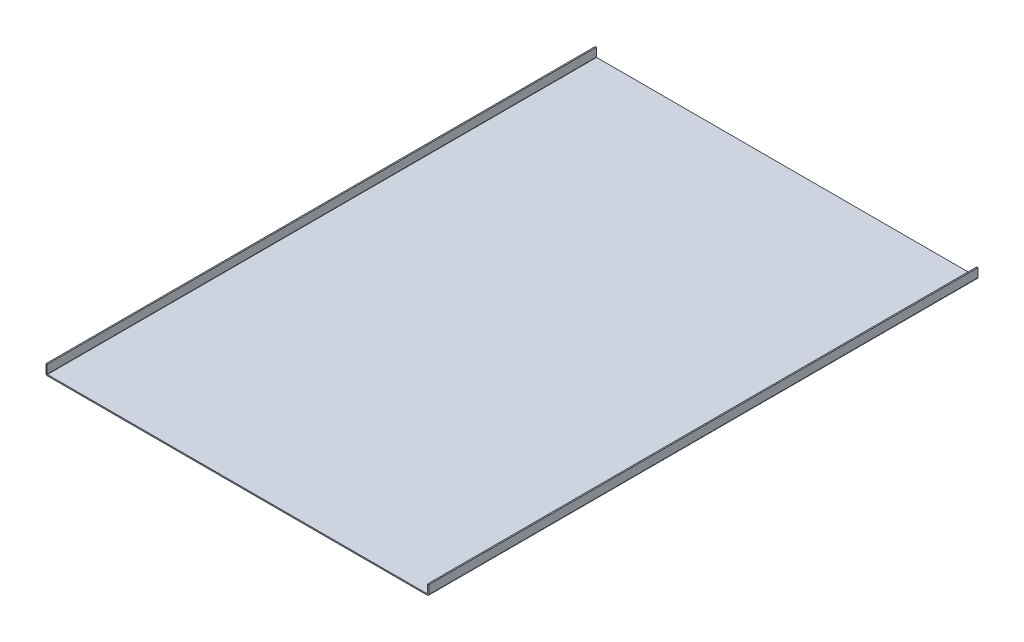
ISO-10303-21;
HEADER;
FILE_DESCRIPTION(('STEP AP214'),'2;1');
FILE_NAME('part.step','',(''),(''),'','','');
FILE_SCHEMA(('AUTOMOTIVE_DESIGN { 1 0 10303 214 1 1 1 1 }'));
ENDSEC;
DATA;
#1=APPLICATION_CONTEXT('core data for automotive mechanical design processes');
#2=APPLICATION_PROTOCOL_DEFINITION('international standard','automotive_design',2000,#1);
#3=PRODUCT_CONTEXT('',#1,'mechanical');
#4=PRODUCT('Part','Part','',(#3));
#5=PRODUCT_RELATED_PRODUCT_CATEGORY('part','',(#4));
#6=PRODUCT_DEFINITION_FORMATION('','',#4);
#7=PRODUCT_DEFINITION_CONTEXT('part definition',#1,'design');
#8=PRODUCT_DEFINITION('design','',#6,#7);
#9=PRODUCT_DEFINITION_SHAPE('','',#8);
#10=(LENGTH_UNIT() NAMED_UNIT(*) SI_UNIT(.MILLI.,.METRE.));
#11=(NAMED_UNIT(*) PLANE_ANGLE_UNIT() SI_UNIT($,.RADIAN.));
#12=(NAMED_UNIT(*) SI_UNIT($,.STERADIAN.) SOLID_ANGLE_UNIT());
#13=UNCERTAINTY_MEASURE_WITH_UNIT(LENGTH_MEASURE(1.E-05),#10,'distance_accuracy_value','');
#14=(GEOMETRIC_REPRESENTATION_CONTEXT(3) GLOBAL_UNCERTAINTY_ASSIGNED_CONTEXT((#13)) GLOBAL_UNIT_ASSIGNED_CONTEXT((#10,
#11,#12)) REPRESENTATION_CONTEXT('',''));
#15=CARTESIAN_POINT('',(0.,0.,0.));
#16=DIRECTION('',(0.,0.,1.));
#17=DIRECTION('',(1.,0.,0.));
#18=AXIS2_PLACEMENT_3D('',#15,#16,#17);
#19=CARTESIAN_POINT('',(0.,-3971.39551359,0.));
#20=DIRECTION('',(0.,1.,0.));
#21=DIRECTION('',(0.,0.,1.));
#22=AXIS2_PLACEMENT_3D('',#19,#20,#21);
#23=PLANE('',#22);
#24=DIRECTION('',(0.,0.,1.));
#25=VECTOR('',#24,1.);
#26=CARTESIAN_POINT('',(-9432.480403508,-3971.39551359,106.));
#27=LINE('',#26,#25);
#28=CARTESIAN_POINT('',(-9432.480403508,-3971.39551359,-1276.));
#29=VERTEX_POINT('',#28);
#30=CARTESIAN_POINT('',(-9432.480403508,-3971.39551359,106.));
#31=VERTEX_POINT('',#30);
#32=EDGE_CURVE('E9',#29,#31,#27,.T.);
#33=ORIENTED_EDGE('',*,*,#32,.T.);
#34=DIRECTION('',(1.,0.,0.));
#35=VECTOR('',#34,1.);
#36=CARTESIAN_POINT('',(-10388.680403508,-3971.39551359,106.));
#37=LINE('',#36,#35);
#38=CARTESIAN_POINT('',(-10388.680403508,-3971.39551359,106.));
#39=VERTEX_POINT('',#38);
#40=EDGE_CURVE('E34',#39,#31,#37,.T.);
#41=ORIENTED_EDGE('',*,*,#40,.F.);
#42=DIRECTION('',(0.,0.,-1.));
#43=VECTOR('',#42,1.);
#44=CARTESIAN_POINT('',(-10388.680403508,-3971.39551359,-1276.));
#45=LINE('',#44,#43);
#46=CARTESIAN_POINT('',(-10388.680403508,-3971.39551359,-1276.));
#47=VERTEX_POINT('',#46);
#48=EDGE_CURVE('E25',#39,#47,#45,.T.);
#49=ORIENTED_EDGE('',*,*,#48,.T.);
#50=DIRECTION('',(-1.,0.,0.));
#51=VECTOR('',#50,1.);
#52=CARTESIAN_POINT('',(-9432.480403508,-3971.39551359,-1276.));
#53=LINE('',#52,#51);
#54=EDGE_CURVE('E194',#29,#47,#53,.T.);
#55=ORIENTED_EDGE('',*,*,#54,.F.);
#56=EDGE_LOOP('',(#33,#41,#49,#55));
#57=FACE_BOUND('',#56,.T.);
#58=ADVANCED_FACE('F15',(#57),#23,.F.);
#59=CARTESIAN_POINT('',(0.,-3968.39551359,0.));
#60=DIRECTION('',(0.,1.,0.));
#61=DIRECTION('',(0.,0.,1.));
#62=AXIS2_PLACEMENT_3D('',#59,#60,#61);
#63=PLANE('',#62);
#64=DIRECTION('',(1.,0.,0.));
#65=VECTOR('',#64,1.);
#66=CARTESIAN_POINT('',(-10388.680403508,-3968.39551359,106.));
#67=LINE('',#66,#65);
#68=CARTESIAN_POINT('',(-10388.680403508,-3968.39551359,106.));
#69=VERTEX_POINT('',#68);
#70=CARTESIAN_POINT('',(-9432.480403508,-3968.39551359,106.));
#71=VERTEX_POINT('',#70);
#72=EDGE_CURVE('E193',#69,#71,#67,.T.);
#73=ORIENTED_EDGE('',*,*,#72,.T.);
#74=DIRECTION('',(0.,0.,1.));
#75=VECTOR('',#74,1.);
#76=CARTESIAN_POINT('',(-9432.480403508,-3968.39551359,106.));
#77=LINE('',#76,#75);
#78=CARTESIAN_POINT('',(-9432.480403508,-3968.39551359,-1276.));
#79=VERTEX_POINT('',#78);
#80=EDGE_CURVE('E141',#79,#71,#77,.T.);
#81=ORIENTED_EDGE('',*,*,#80,.F.);
#82=DIRECTION('',(-1.,0.,0.));
#83=VECTOR('',#82,1.);
#84=CARTESIAN_POINT('',(-9432.480403508,-3968.39551359,-1276.));
#85=LINE('',#84,#83);
#86=CARTESIAN_POINT('',(-10388.680403508,-3968.39551359,-1276.));
#87=VERTEX_POINT('',#86);
#88=EDGE_CURVE('E190',#79,#87,#85,.T.);
#89=ORIENTED_EDGE('',*,*,#88,.T.);
#90=DIRECTION('',(0.,0.,-1.));
#91=VECTOR('',#90,1.);
#92=CARTESIAN_POINT('',(-10388.680403508,-3968.39551359,-1276.));
#93=LINE('',#92,#91);
#94=EDGE_CURVE('E180',#69,#87,#93,.T.);
#95=ORIENTED_EDGE('',*,*,#94,.F.);
#96=EDGE_LOOP('',(#73,#81,#89,#95));
#97=FACE_BOUND('',#96,.T.);
#98=ADVANCED_FACE('F224',(#97),#63,.T.);
#99=CARTESIAN_POINT('',(-9425.780403508,-3971.39551359,-1276.));
#100=DIRECTION('',(0.,0.,-1.));
#101=DIRECTION('',(-1.,0.,0.));
#102=AXIS2_PLACEMENT_3D('',#99,#100,#101);
#103=PLANE('',#102);
#104=ORIENTED_EDGE('',*,*,#88,.F.);
#105=CARTESIAN_POINT('',(-9432.480403508,-3967.89551359,-1276.));
#106=DIRECTION('',(0.,0.,-1.));
#107=DIRECTION('',(0.,-1.,0.));
#108=AXIS2_PLACEMENT_3D('',#105,#106,#107);
#109=CIRCLE('',#108,0.500000000000611);
#110=CARTESIAN_POINT('',(-9431.980403508,-3967.89551359,-1276.));
#111=VERTEX_POINT('',#110);
#112=EDGE_CURVE('E133',#111,#79,#109,.T.);
#113=ORIENTED_EDGE('',*,*,#112,.F.);
#114=DIRECTION('',(0.,1.,0.));
#115=VECTOR('',#114,1.);
#116=CARTESIAN_POINT('',(-9431.980403508,-3946.39551359,-1276.));
#117=LINE('',#116,#115);
#118=CARTESIAN_POINT('',(-9431.980403508,-3946.39551359,-1276.));
#119=VERTEX_POINT('',#118);
#120=EDGE_CURVE('E111',#111,#119,#117,.T.);
#121=ORIENTED_EDGE('',*,*,#120,.T.);
#122=DIRECTION('',(-1.,0.,0.));
#123=VECTOR('',#122,1.);
#124=CARTESIAN_POINT('',(-9428.980403508,-3946.39551359,-1276.));
#125=LINE('',#124,#123);
#126=CARTESIAN_POINT('',(-9428.980403508,-3946.39551359,-1276.));
#127=VERTEX_POINT('',#126);
#128=EDGE_CURVE('E101',#127,#119,#125,.T.);
#129=ORIENTED_EDGE('',*,*,#128,.F.);
#130=DIRECTION('',(0.,1.,0.));
#131=VECTOR('',#130,1.);
#132=CARTESIAN_POINT('',(-9428.980403508,-3967.89551359,-1276.));
#133=LINE('',#132,#131);
#134=CARTESIAN_POINT('',(-9428.980403508,-3967.89551359,-1276.));
#135=VERTEX_POINT('',#134);
#136=EDGE_CURVE('E109',#135,#127,#133,.T.);
#137=ORIENTED_EDGE('',*,*,#136,.F.);
#138=CARTESIAN_POINT('',(-9432.480403508,-3967.89551359,-1276.));
#139=DIRECTION('',(0.,0.,-1.));
#140=DIRECTION('',(0.,-1.,0.));
#141=AXIS2_PLACEMENT_3D('',#138,#139,#140);
#142=CIRCLE('',#141,3.50000000000061);
#143=EDGE_CURVE('E140',#135,#29,#142,.T.);
#144=ORIENTED_EDGE('',*,*,#143,.T.);
#145=ORIENTED_EDGE('',*,*,#54,.T.);
#146=CARTESIAN_POINT('',(-10388.680403508,-3967.89551359,-1276.));
#147=DIRECTION('',(0.,0.,-1.));
#148=DIRECTION('',(1.,0.,0.));
#149=AXIS2_PLACEMENT_3D('',#146,#147,#148);
#150=CIRCLE('',#149,3.50000000000061);
#151=CARTESIAN_POINT('',(-10392.180403508,-3967.89551359,-1276.));
#152=VERTEX_POINT('',#151);
#153=EDGE_CURVE('E182',#47,#152,#150,.T.);
#154=ORIENTED_EDGE('',*,*,#153,.T.);
#155=DIRECTION('',(0.,-1.,0.));
#156=VECTOR('',#155,1.);
#157=CARTESIAN_POINT('',(-10392.180403508,-3946.39551359,-1276.));
#158=LINE('',#157,#156);
#159=CARTESIAN_POINT('',(-10392.180403508,-3946.39551359,-1276.));
#160=VERTEX_POINT('',#159);
#161=EDGE_CURVE('E153',#160,#152,#158,.T.);
#162=ORIENTED_EDGE('',*,*,#161,.F.);
#163=DIRECTION('',(1.,0.,0.));
#164=VECTOR('',#163,1.);
#165=CARTESIAN_POINT('',(-10392.180403508,-3946.39551359,-1276.));
#166=LINE('',#165,#164);
#167=CARTESIAN_POINT('',(-10389.180403508,-3946.39551359,-1276.));
#168=VERTEX_POINT('',#167);
#169=EDGE_CURVE('E161',#160,#168,#166,.T.);
#170=ORIENTED_EDGE('',*,*,#169,.T.);
#171=DIRECTION('',(0.,-1.,0.));
#172=VECTOR('',#171,1.);
#173=CARTESIAN_POINT('',(-10389.180403508,-3967.89551359,-1276.));
#174=LINE('',#173,#172);
#175=CARTESIAN_POINT('',(-10389.180403508,-3967.89551359,-1276.));
#176=VERTEX_POINT('',#175);
#177=EDGE_CURVE('E158',#168,#176,#174,.T.);
#178=ORIENTED_EDGE('',*,*,#177,.T.);
#179=CARTESIAN_POINT('',(-10388.680403508,-3967.89551359,-1276.));
#180=DIRECTION('',(0.,0.,-1.));
#181=DIRECTION('',(1.,0.,0.));
#182=AXIS2_PLACEMENT_3D('',#179,#180,#181);
#183=CIRCLE('',#182,0.500000000000611);
#184=EDGE_CURVE('E176',#87,#176,#183,.T.);
#185=ORIENTED_EDGE('',*,*,#184,.F.);
#186=EDGE_LOOP('',(#104,#113,#121,#129,#137,#144,#145,#154,#162,#170,#178,#185));
#187=FACE_BOUND('',#186,.T.);
#188=ADVANCED_FACE('F107',(#187),#103,.T.);
#189=CARTESIAN_POINT('',(-9425.780403508,-3971.39551359,106.));
#190=DIRECTION('',(0.,0.,1.));
#191=DIRECTION('',(1.,0.,0.));
#192=AXIS2_PLACEMENT_3D('',#189,#190,#191);
#193=PLANE('',#192);
#194=ORIENTED_EDGE('',*,*,#40,.T.);
#195=CARTESIAN_POINT('',(-9432.480403508,-3967.89551359,106.));
#196=DIRECTION('',(0.,0.,1.));
#197=DIRECTION('',(0.,-1.,0.));
#198=AXIS2_PLACEMENT_3D('',#195,#196,#197);
#199=CIRCLE('',#198,3.50000000000061);
#200=CARTESIAN_POINT('',(-9428.980403508,-3967.89551359,106.));
#201=VERTEX_POINT('',#200);
#202=EDGE_CURVE('E143',#31,#201,#199,.T.);
#203=ORIENTED_EDGE('',*,*,#202,.T.);
#204=DIRECTION('',(0.,-1.,0.));
#205=VECTOR('',#204,1.);
#206=CARTESIAN_POINT('',(-9428.980403508,-3946.39551359,106.));
#207=LINE('',#206,#205);
#208=CARTESIAN_POINT('',(-9428.980403508,-3946.39551359,106.));
#209=VERTEX_POINT('',#208);
#210=EDGE_CURVE('E126',#209,#201,#207,.T.);
#211=ORIENTED_EDGE('',*,*,#210,.F.);
#212=DIRECTION('',(-1.,0.,0.));
#213=VECTOR('',#212,1.);
#214=CARTESIAN_POINT('',(-9428.980403508,-3946.39551359,106.));
#215=LINE('',#214,#213);
#216=CARTESIAN_POINT('',(-9431.980403508,-3946.39551359,106.));
#217=VERTEX_POINT('',#216);
#218=EDGE_CURVE('E125',#209,#217,#215,.T.);
#219=ORIENTED_EDGE('',*,*,#218,.T.);
#220=DIRECTION('',(0.,-1.,0.));
#221=VECTOR('',#220,1.);
#222=CARTESIAN_POINT('',(-9431.980403508,-3967.89551359,106.));
#223=LINE('',#222,#221);
#224=CARTESIAN_POINT('',(-9431.980403508,-3967.89551359,106.));
#225=VERTEX_POINT('',#224);
#226=EDGE_CURVE('E130',#217,#225,#223,.T.);
#227=ORIENTED_EDGE('',*,*,#226,.T.);
#228=CARTESIAN_POINT('',(-9432.480403508,-3967.89551359,106.));
#229=DIRECTION('',(0.,0.,1.));
#230=DIRECTION('',(0.,-1.,0.));
#231=AXIS2_PLACEMENT_3D('',#228,#229,#230);
#232=CIRCLE('',#231,0.500000000000611);
#233=EDGE_CURVE('E138',#71,#225,#232,.T.);
#234=ORIENTED_EDGE('',*,*,#233,.F.);
#235=ORIENTED_EDGE('',*,*,#72,.F.);
#236=CARTESIAN_POINT('',(-10388.680403508,-3967.89551359,106.));
#237=DIRECTION('',(0.,0.,1.));
#238=DIRECTION('',(1.,0.,0.));
#239=AXIS2_PLACEMENT_3D('',#236,#237,#238);
#240=CIRCLE('',#239,0.500000000000611);
#241=CARTESIAN_POINT('',(-10389.180403508,-3967.89551359,106.));
#242=VERTEX_POINT('',#241);
#243=EDGE_CURVE('E172',#242,#69,#240,.T.);
#244=ORIENTED_EDGE('',*,*,#243,.F.);
#245=DIRECTION('',(0.,1.,0.));
#246=VECTOR('',#245,1.);
#247=CARTESIAN_POINT('',(-10389.180403508,-3946.39551359,106.));
#248=LINE('',#247,#246);
#249=CARTESIAN_POINT('',(-10389.180403508,-3946.39551359,106.));
#250=VERTEX_POINT('',#249);
#251=EDGE_CURVE('E164',#242,#250,#248,.T.);
#252=ORIENTED_EDGE('',*,*,#251,.T.);
#253=DIRECTION('',(1.,0.,0.));
#254=VECTOR('',#253,1.);
#255=CARTESIAN_POINT('',(-10392.180403508,-3946.39551359,106.));
#256=LINE('',#255,#254);
#257=CARTESIAN_POINT('',(-10392.180403508,-3946.39551359,106.));
#258=VERTEX_POINT('',#257);
#259=EDGE_CURVE('E147',#258,#250,#256,.T.);
#260=ORIENTED_EDGE('',*,*,#259,.F.);
#261=DIRECTION('',(0.,1.,0.));
#262=VECTOR('',#261,1.);
#263=CARTESIAN_POINT('',(-10392.180403508,-3967.89551359,106.));
#264=LINE('',#263,#262);
#265=CARTESIAN_POINT('',(-10392.180403508,-3967.89551359,106.));
#266=VERTEX_POINT('',#265);
#267=EDGE_CURVE('E157',#266,#258,#264,.T.);
#268=ORIENTED_EDGE('',*,*,#267,.F.);
#269=CARTESIAN_POINT('',(-10388.680403508,-3967.89551359,106.));
#270=DIRECTION('',(0.,0.,1.));
#271=DIRECTION('',(1.,0.,0.));
#272=AXIS2_PLACEMENT_3D('',#269,#270,#271);
#273=CIRCLE('',#272,3.50000000000061);
#274=EDGE_CURVE('E179',#266,#39,#273,.T.);
#275=ORIENTED_EDGE('',*,*,#274,.T.);
#276=EDGE_LOOP('',(#194,#203,#211,#219,#227,#234,#235,#244,#252,#260,#268,#275));
#277=FACE_BOUND('',#276,.T.);
#278=ADVANCED_FACE('F230',(#277),#193,.T.);
#279=CARTESIAN_POINT('',(-10388.680403508,-3967.89551359,106.));
#280=DIRECTION('',(0.,0.,1.));
#281=DIRECTION('',(1.,0.,0.));
#282=AXIS2_PLACEMENT_3D('',#279,#280,#281);
#283=CYLINDRICAL_SURFACE('',#282,3.50000000000061);
#284=ORIENTED_EDGE('',*,*,#48,.F.);
#285=ORIENTED_EDGE('',*,*,#274,.F.);
#286=DIRECTION('',(0.,0.,-1.));
#287=VECTOR('',#286,1.);
#288=CARTESIAN_POINT('',(-10392.180403508,-3967.89551359,-1276.));
#289=LINE('',#288,#287);
#290=EDGE_CURVE('E177',#266,#152,#289,.T.);
#291=ORIENTED_EDGE('',*,*,#290,.T.);
#292=ORIENTED_EDGE('',*,*,#153,.F.);
#293=EDGE_LOOP('',(#284,#285,#291,#292));
#294=FACE_BOUND('',#293,.T.);
#295=ADVANCED_FACE('F17',(#294),#283,.T.);
#296=CARTESIAN_POINT('',(-10388.680403508,-3967.89551359,106.));
#297=DIRECTION('',(0.,0.,1.));
#298=DIRECTION('',(1.,0.,0.));
#299=AXIS2_PLACEMENT_3D('',#296,#297,#298);
#300=CYLINDRICAL_SURFACE('',#299,0.500000000000611);
#301=ORIENTED_EDGE('',*,*,#94,.T.);
#302=ORIENTED_EDGE('',*,*,#184,.T.);
#303=DIRECTION('',(0.,0.,1.));
#304=VECTOR('',#303,1.);
#305=CARTESIAN_POINT('',(-10389.180403508,-3967.89551359,-1276.));
#306=LINE('',#305,#304);
#307=EDGE_CURVE('E173',#176,#242,#306,.T.);
#308=ORIENTED_EDGE('',*,*,#307,.T.);
#309=ORIENTED_EDGE('',*,*,#243,.T.);
#310=EDGE_LOOP('',(#301,#302,#308,#309));
#311=FACE_BOUND('',#310,.T.);
#312=ADVANCED_FACE('F221',(#311),#300,.F.);
#313=CARTESIAN_POINT('',(-10392.180403508,0.,0.));
#314=DIRECTION('',(1.,0.,0.));
#315=DIRECTION('',(0.,0.,-1.));
#316=AXIS2_PLACEMENT_3D('',#313,#314,#315);
#317=PLANE('',#316);
#318=ORIENTED_EDGE('',*,*,#290,.F.);
#319=ORIENTED_EDGE('',*,*,#267,.T.);
#320=DIRECTION('',(0.,0.,-1.));
#321=VECTOR('',#320,1.);
#322=CARTESIAN_POINT('',(-10392.180403508,-3946.39551359,106.));
#323=LINE('',#322,#321);
#324=EDGE_CURVE('E154',#258,#160,#323,.T.);
#325=ORIENTED_EDGE('',*,*,#324,.T.);
#326=ORIENTED_EDGE('',*,*,#161,.T.);
#327=EDGE_LOOP('',(#318,#319,#325,#326));
#328=FACE_BOUND('',#327,.T.);
#329=ADVANCED_FACE('F210',(#328),#317,.F.);
#330=CARTESIAN_POINT('',(-10389.180403508,0.,0.));
#331=DIRECTION('',(1.,0.,0.));
#332=DIRECTION('',(0.,0.,-1.));
#333=AXIS2_PLACEMENT_3D('',#330,#331,#332);
#334=PLANE('',#333);
#335=ORIENTED_EDGE('',*,*,#251,.F.);
#336=ORIENTED_EDGE('',*,*,#307,.F.);
#337=ORIENTED_EDGE('',*,*,#177,.F.);
#338=DIRECTION('',(0.,0.,-1.));
#339=VECTOR('',#338,1.);
#340=CARTESIAN_POINT('',(-10389.180403508,-3946.39551359,-1276.));
#341=LINE('',#340,#339);
#342=EDGE_CURVE('E150',#250,#168,#341,.T.);
#343=ORIENTED_EDGE('',*,*,#342,.F.);
#344=EDGE_LOOP('',(#335,#336,#337,#343));
#345=FACE_BOUND('',#344,.T.);
#346=ADVANCED_FACE('F219',(#345),#334,.T.);
#347=CARTESIAN_POINT('',(-10392.180403508,-3946.39551359,-1276.));
#348=DIRECTION('',(0.,-1.,0.));
#349=DIRECTION('',(1.,0.,0.));
#350=AXIS2_PLACEMENT_3D('',#347,#348,#349);
#351=PLANE('',#350);
#352=ORIENTED_EDGE('',*,*,#342,.T.);
#353=ORIENTED_EDGE('',*,*,#169,.F.);
#354=ORIENTED_EDGE('',*,*,#324,.F.);
#355=ORIENTED_EDGE('',*,*,#259,.T.);
#356=EDGE_LOOP('',(#352,#353,#354,#355));
#357=FACE_BOUND('',#356,.T.);
#358=ADVANCED_FACE('F214',(#357),#351,.F.);
#359=CARTESIAN_POINT('',(-9432.480403508,-3967.89551359,-1276.));
#360=DIRECTION('',(0.,0.,-1.));
#361=DIRECTION('',(0.,-1.,0.));
#362=AXIS2_PLACEMENT_3D('',#359,#360,#361);
#363=CYLINDRICAL_SURFACE('',#362,3.50000000000061);
#364=ORIENTED_EDGE('',*,*,#32,.F.);
#365=ORIENTED_EDGE('',*,*,#143,.F.);
#366=DIRECTION('',(0.,0.,1.));
#367=VECTOR('',#366,1.);
#368=CARTESIAN_POINT('',(-9428.980403508,-3967.89551359,106.));
#369=LINE('',#368,#367);
#370=EDGE_CURVE('E119',#135,#201,#369,.T.);
#371=ORIENTED_EDGE('',*,*,#370,.T.);
#372=ORIENTED_EDGE('',*,*,#202,.F.);
#373=EDGE_LOOP('',(#364,#365,#371,#372));
#374=FACE_BOUND('',#373,.T.);
#375=ADVANCED_FACE('F233',(#374),#363,.T.);
#376=CARTESIAN_POINT('',(-9432.480403508,-3967.89551359,-1276.));
#377=DIRECTION('',(0.,0.,-1.));
#378=DIRECTION('',(0.,-1.,0.));
#379=AXIS2_PLACEMENT_3D('',#376,#377,#378);
#380=CYLINDRICAL_SURFACE('',#379,0.500000000000611);
#381=ORIENTED_EDGE('',*,*,#80,.T.);
#382=ORIENTED_EDGE('',*,*,#233,.T.);
#383=DIRECTION('',(0.,0.,-1.));
#384=VECTOR('',#383,1.);
#385=CARTESIAN_POINT('',(-9431.980403508,-3967.89551359,106.));
#386=LINE('',#385,#384);
#387=EDGE_CURVE('E135',#225,#111,#386,.T.);
#388=ORIENTED_EDGE('',*,*,#387,.T.);
#389=ORIENTED_EDGE('',*,*,#112,.T.);
#390=EDGE_LOOP('',(#381,#382,#388,#389));
#391=FACE_BOUND('',#390,.T.);
#392=ADVANCED_FACE('F226',(#391),#380,.F.);
#393=CARTESIAN_POINT('',(-9428.980403508,0.,0.));
#394=DIRECTION('',(-1.,0.,0.));
#395=DIRECTION('',(0.,0.,1.));
#396=AXIS2_PLACEMENT_3D('',#393,#394,#395);
#397=PLANE('',#396);
#398=ORIENTED_EDGE('',*,*,#370,.F.);
#399=ORIENTED_EDGE('',*,*,#136,.T.);
#400=DIRECTION('',(0.,0.,1.));
#401=VECTOR('',#400,1.);
#402=CARTESIAN_POINT('',(-9428.980403508,-3946.39551359,-1276.));
#403=LINE('',#402,#401);
#404=EDGE_CURVE('E118',#127,#209,#403,.T.);
#405=ORIENTED_EDGE('',*,*,#404,.T.);
#406=ORIENTED_EDGE('',*,*,#210,.T.);
#407=EDGE_LOOP('',(#398,#399,#405,#406));
#408=FACE_BOUND('',#407,.T.);
#409=ADVANCED_FACE('F116',(#408),#397,.F.);
#410=CARTESIAN_POINT('',(-9431.980403508,0.,0.));
#411=DIRECTION('',(-1.,0.,0.));
#412=DIRECTION('',(0.,0.,1.));
#413=AXIS2_PLACEMENT_3D('',#410,#411,#412);
#414=PLANE('',#413);
#415=ORIENTED_EDGE('',*,*,#120,.F.);
#416=ORIENTED_EDGE('',*,*,#387,.F.);
#417=ORIENTED_EDGE('',*,*,#226,.F.);
#418=DIRECTION('',(0.,0.,1.));
#419=VECTOR('',#418,1.);
#420=CARTESIAN_POINT('',(-9431.980403508,-3946.39551359,106.));
#421=LINE('',#420,#419);
#422=EDGE_CURVE('E19',#119,#217,#421,.T.);
#423=ORIENTED_EDGE('',*,*,#422,.F.);
#424=EDGE_LOOP('',(#415,#416,#417,#423));
#425=FACE_BOUND('',#424,.T.);
#426=ADVANCED_FACE('F229',(#425),#414,.T.);
#427=CARTESIAN_POINT('',(-9428.980403508,-3946.39551359,106.));
#428=DIRECTION('',(0.,-1.,0.));
#429=DIRECTION('',(1.,0.,0.));
#430=AXIS2_PLACEMENT_3D('',#427,#428,#429);
#431=PLANE('',#430);
#432=ORIENTED_EDGE('',*,*,#422,.T.);
#433=ORIENTED_EDGE('',*,*,#218,.F.);
#434=ORIENTED_EDGE('',*,*,#404,.F.);
#435=ORIENTED_EDGE('',*,*,#128,.T.);
#436=EDGE_LOOP('',(#432,#433,#434,#435));
#437=FACE_BOUND('',#436,.T.);
#438=ADVANCED_FACE('F123',(#437),#431,.F.);
#439=CLOSED_SHELL('',(#58,#98,#188,#278,#295,#312,#329,#346,#358,#375,#392,#409,#426,#438));
#440=MANIFOLD_SOLID_BREP('B1',#439);
#441=ADVANCED_BREP_SHAPE_REPRESENTATION('',(#18,#440),#14);
#442=SHAPE_DEFINITION_REPRESENTATION(#9,#441);
ENDSEC;
END-ISO-10303-21;
